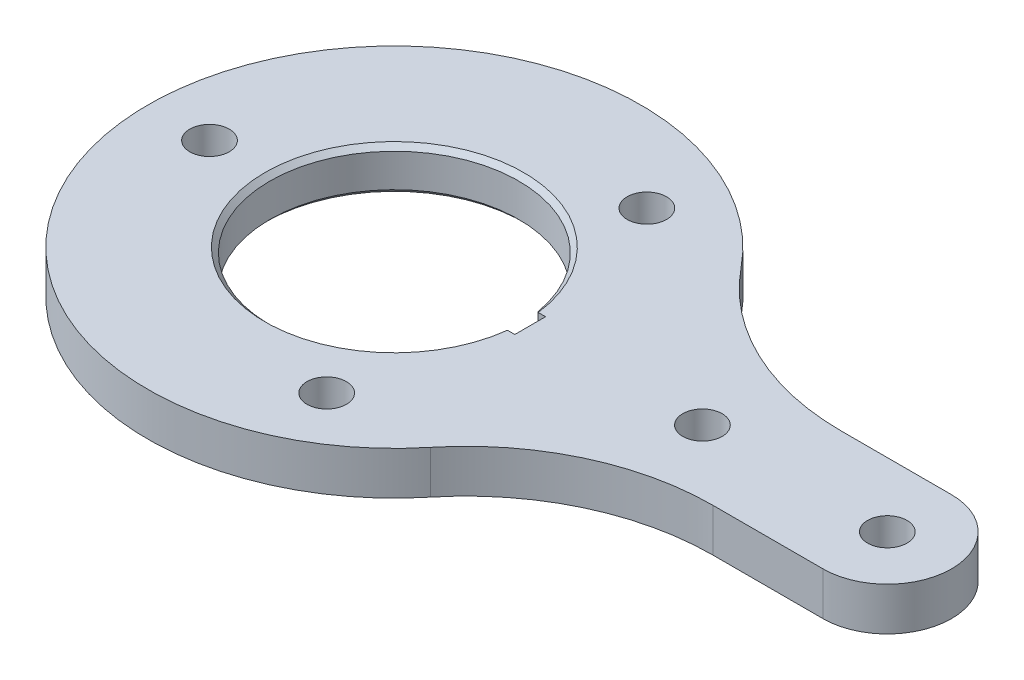
ISO-10303-21;
HEADER;
FILE_DESCRIPTION(('STEP AP214'),'2;1');
FILE_NAME('part.step','',(''),(''),'','','');
FILE_SCHEMA(('AUTOMOTIVE_DESIGN { 1 0 10303 214 1 1 1 1 }'));
ENDSEC;
DATA;
#1=APPLICATION_CONTEXT('core data for automotive mechanical design processes');
#2=APPLICATION_PROTOCOL_DEFINITION('international standard','automotive_design',2000,#1);
#3=PRODUCT_CONTEXT('',#1,'mechanical');
#4=PRODUCT('Part','Part','',(#3));
#5=PRODUCT_RELATED_PRODUCT_CATEGORY('part','',(#4));
#6=PRODUCT_DEFINITION_FORMATION('','',#4);
#7=PRODUCT_DEFINITION_CONTEXT('part definition',#1,'design');
#8=PRODUCT_DEFINITION('design','',#6,#7);
#9=PRODUCT_DEFINITION_SHAPE('','',#8);
#10=(LENGTH_UNIT() NAMED_UNIT(*) SI_UNIT(.MILLI.,.METRE.));
#11=(NAMED_UNIT(*) PLANE_ANGLE_UNIT() SI_UNIT($,.RADIAN.));
#12=(NAMED_UNIT(*) SI_UNIT($,.STERADIAN.) SOLID_ANGLE_UNIT());
#13=UNCERTAINTY_MEASURE_WITH_UNIT(LENGTH_MEASURE(1.E-05),#10,'distance_accuracy_value','');
#14=(GEOMETRIC_REPRESENTATION_CONTEXT(3) GLOBAL_UNCERTAINTY_ASSIGNED_CONTEXT((#13)) GLOBAL_UNIT_ASSIGNED_CONTEXT((#10,
#11,#12)) REPRESENTATION_CONTEXT('',''));
#15=CARTESIAN_POINT('',(0.,0.,0.));
#16=DIRECTION('',(0.,0.,1.));
#17=DIRECTION('',(1.,0.,0.));
#18=AXIS2_PLACEMENT_3D('',#15,#16,#17);
#19=CARTESIAN_POINT('',(-35.,1.75,25.));
#20=DIRECTION('',(0.,-1.,0.));
#21=DIRECTION('',(0.,0.,-1.));
#22=AXIS2_PLACEMENT_3D('',#19,#20,#21);
#23=PLANE('',#22);
#24=DIRECTION('',(1.,0.,0.));
#25=VECTOR('',#24,1.);
#26=CARTESIAN_POINT('',(-2.97764997617824,1.75,1.25));
#27=LINE('',#26,#25);
#28=CARTESIAN_POINT('',(-3.51711203719619,1.75,1.25));
#29=VERTEX_POINT('',#28);
#30=CARTESIAN_POINT('',(-2.97764997617824,1.75,1.25));
#31=VERTEX_POINT('',#30);
#32=EDGE_CURVE('E168',#29,#31,#27,.T.);
#33=ORIENTED_EDGE('',*,*,#32,.F.);
#34=DIRECTION('',(0.78918367740125,0.,-0.614157246414499));
#35=VECTOR('',#34,1.);
#36=CARTESIAN_POINT('',(-3.51711203719619,1.75,1.25));
#37=LINE('',#36,#35);
#38=CARTESIAN_POINT('',(-3.58072522275954,1.75,1.29950495049504));
#39=VERTEX_POINT('',#38);
#40=EDGE_CURVE('E304',#29,#39,#37,.F.);
#41=ORIENTED_EDGE('',*,*,#40,.T.);
#42=CARTESIAN_POINT('',(-14.,1.75,0.));
#43=DIRECTION('',(0.,-1.,0.));
#44=DIRECTION('',(0.,0.,-1.));
#45=AXIS2_PLACEMENT_3D('',#42,#43,#44);
#46=CIRCLE('',#45,10.5);
#47=CARTESIAN_POINT('',(-3.57467026900346,1.75,-1.25));
#48=VERTEX_POINT('',#47);
#49=EDGE_CURVE('E301',#39,#48,#46,.T.);
#50=ORIENTED_EDGE('',*,*,#49,.T.);
#51=DIRECTION('',(-1.,0.,0.));
#52=VECTOR('',#51,1.);
#53=CARTESIAN_POINT('',(-2.97764997617824,1.75,-1.25));
#54=LINE('',#53,#52);
#55=CARTESIAN_POINT('',(-2.97764997617824,1.75,-1.25));
#56=VERTEX_POINT('',#55);
#57=EDGE_CURVE('E162',#56,#48,#54,.T.);
#58=ORIENTED_EDGE('',*,*,#57,.F.);
#59=DIRECTION('',(0.,0.,-1.));
#60=VECTOR('',#59,1.);
#61=CARTESIAN_POINT('',(-2.97764997617824,1.75,1.25));
#62=LINE('',#61,#60);
#63=EDGE_CURVE('E185',#31,#56,#62,.T.);
#64=ORIENTED_EDGE('',*,*,#63,.F.);
#65=EDGE_LOOP('',(#33,#41,#50,#58,#64));
#66=FACE_BOUND('',#65,.T.);
#67=CARTESIAN_POINT('',(11.,1.75,0.));
#68=DIRECTION('',(0.,1.,0.));
#69=DIRECTION('',(-1.,0.,0.));
#70=AXIS2_PLACEMENT_3D('',#67,#68,#69);
#71=CIRCLE('',#70,1.6);
#72=CARTESIAN_POINT('',(9.4,1.75,0.));
#73=VERTEX_POINT('',#72);
#74=EDGE_CURVE('E272',#73,#73,#71,.T.);
#75=ORIENTED_EDGE('',*,*,#74,.F.);
#76=EDGE_LOOP('',(#75));
#77=FACE_BOUND('',#76,.T.);
#78=CARTESIAN_POINT('',(-6.50000000000012,1.75,12.9903810567666));
#79=DIRECTION('',(0.,1.,0.));
#80=DIRECTION('',(-1.,0.,0.));
#81=AXIS2_PLACEMENT_3D('',#78,#79,#80);
#82=CIRCLE('',#81,1.6);
#83=CARTESIAN_POINT('',(-8.10000000000012,1.75,12.9903810567666));
#84=VERTEX_POINT('',#83);
#85=EDGE_CURVE('E264',#84,#84,#82,.T.);
#86=ORIENTED_EDGE('',*,*,#85,.F.);
#87=EDGE_LOOP('',(#86));
#88=FACE_BOUND('',#87,.T.);
#89=CARTESIAN_POINT('',(-29.,1.75,0.));
#90=DIRECTION('',(0.,1.,0.));
#91=DIRECTION('',(1.,0.,0.));
#92=AXIS2_PLACEMENT_3D('',#89,#90,#91);
#93=CIRCLE('',#92,1.6);
#94=CARTESIAN_POINT('',(-27.4,1.75,0.));
#95=VERTEX_POINT('',#94);
#96=EDGE_CURVE('E263',#95,#95,#93,.T.);
#97=ORIENTED_EDGE('',*,*,#96,.F.);
#98=EDGE_LOOP('',(#97));
#99=FACE_BOUND('',#98,.T.);
#100=CARTESIAN_POINT('',(-6.49999999999994,1.75,-12.9903810567665));
#101=DIRECTION('',(0.,1.,0.));
#102=DIRECTION('',(-1.,0.,0.));
#103=AXIS2_PLACEMENT_3D('',#100,#101,#102);
#104=CIRCLE('',#103,1.6);
#105=CARTESIAN_POINT('',(-8.09999999999994,1.75,-12.9903810567665));
#106=VERTEX_POINT('',#105);
#107=EDGE_CURVE('E282',#106,#106,#104,.T.);
#108=ORIENTED_EDGE('',*,*,#107,.F.);
#109=EDGE_LOOP('',(#108));
#110=FACE_BOUND('',#109,.T.);
#111=CARTESIAN_POINT('',(26.,1.75,0.));
#112=DIRECTION('',(0.,1.,0.));
#113=DIRECTION('',(-1.,0.,0.));
#114=AXIS2_PLACEMENT_3D('',#111,#112,#113);
#115=CIRCLE('',#114,1.60000000000001);
#116=CARTESIAN_POINT('',(24.4,1.75,0.));
#117=VERTEX_POINT('',#116);
#118=EDGE_CURVE('E243',#117,#117,#115,.T.);
#119=ORIENTED_EDGE('',*,*,#118,.F.);
#120=EDGE_LOOP('',(#119));
#121=FACE_BOUND('',#120,.T.);
#122=CARTESIAN_POINT('',(17.0547121487669,1.75,-25.2206659498865));
#123=DIRECTION('',(0.,-1.,0.));
#124=DIRECTION('',(0.,0.,1.));
#125=AXIS2_PLACEMENT_3D('',#122,#123,#124);
#126=CIRCLE('',#125,20.005963775399);
#127=CARTESIAN_POINT('',(17.0547121487669,1.75,-5.21470217448756));
#128=VERTEX_POINT('',#127);
#129=CARTESIAN_POINT('',(1.52504137788749,1.75,-12.6084531253791));
#130=VERTEX_POINT('',#129);
#131=EDGE_CURVE('E191',#128,#130,#126,.T.);
#132=ORIENTED_EDGE('',*,*,#131,.T.);
#133=CARTESIAN_POINT('',(-14.,1.75,0.));
#134=DIRECTION('',(0.,1.,0.));
#135=DIRECTION('',(0.,0.,1.));
#136=AXIS2_PLACEMENT_3D('',#133,#134,#135);
#137=CIRCLE('',#136,20.);
#138=CARTESIAN_POINT('',(1.52504137788749,1.75,12.6084531253791));
#139=VERTEX_POINT('',#138);
#140=EDGE_CURVE('E221',#130,#139,#137,.T.);
#141=ORIENTED_EDGE('',*,*,#140,.T.);
#142=CARTESIAN_POINT('',(17.0547121487669,1.75,25.2206659498865));
#143=DIRECTION('',(0.,-1.,0.));
#144=DIRECTION('',(0.,0.,-1.));
#145=AXIS2_PLACEMENT_3D('',#142,#143,#144);
#146=CIRCLE('',#145,20.005963775399);
#147=CARTESIAN_POINT('',(17.0547121487669,1.75,5.21470217448756));
#148=VERTEX_POINT('',#147);
#149=EDGE_CURVE('E225',#139,#148,#146,.T.);
#150=ORIENTED_EDGE('',*,*,#149,.T.);
#151=DIRECTION('',(1.,0.,0.));
#152=VECTOR('',#151,1.);
#153=CARTESIAN_POINT('',(17.0547121487669,1.75,5.21470217448757));
#154=LINE('',#153,#152);
#155=CARTESIAN_POINT('',(26.,1.75,5.21470217448757));
#156=VERTEX_POINT('',#155);
#157=EDGE_CURVE('E229',#148,#156,#154,.T.);
#158=ORIENTED_EDGE('',*,*,#157,.T.);
#159=CARTESIAN_POINT('',(26.,1.75,0.));
#160=DIRECTION('',(0.,1.,0.));
#161=DIRECTION('',(0.,0.,1.));
#162=AXIS2_PLACEMENT_3D('',#159,#160,#161);
#163=CIRCLE('',#162,5.21470217448757);
#164=CARTESIAN_POINT('',(26.,1.75,-5.21470217448757));
#165=VERTEX_POINT('',#164);
#166=EDGE_CURVE('E233',#156,#165,#163,.T.);
#167=ORIENTED_EDGE('',*,*,#166,.T.);
#168=DIRECTION('',(-1.,0.,0.));
#169=VECTOR('',#168,1.);
#170=CARTESIAN_POINT('',(17.0547121487669,1.75,-5.21470217448756));
#171=LINE('',#170,#169);
#172=EDGE_CURVE('E197',#165,#128,#171,.T.);
#173=ORIENTED_EDGE('',*,*,#172,.T.);
#174=EDGE_LOOP('',(#132,#141,#150,#158,#167,#173));
#175=FACE_BOUND('',#174,.T.);
#176=ADVANCED_FACE('F42',(#66,#77,#88,#99,#110,#121,#175),#23,.F.);
#177=CARTESIAN_POINT('',(-35.,-1.75,25.));
#178=DIRECTION('',(0.,1.,0.));
#179=DIRECTION('',(0.,0.,1.));
#180=AXIS2_PLACEMENT_3D('',#177,#178,#179);
#181=PLANE('',#180);
#182=CARTESIAN_POINT('',(-14.,-1.75,0.));
#183=DIRECTION('',(0.,1.,0.));
#184=DIRECTION('',(0.,0.,1.));
#185=AXIS2_PLACEMENT_3D('',#182,#183,#184);
#186=CIRCLE('',#185,10.5);
#187=CARTESIAN_POINT('',(-3.57467026900349,-1.75,-1.25));
#188=VERTEX_POINT('',#187);
#189=CARTESIAN_POINT('',(-3.58072522275957,-1.75,1.29950495049507));
#190=VERTEX_POINT('',#189);
#191=EDGE_CURVE('E320',#188,#190,#186,.T.);
#192=ORIENTED_EDGE('',*,*,#191,.T.);
#193=DIRECTION('',(-0.78918367740125,0.,0.614157246414499));
#194=VECTOR('',#193,1.);
#195=CARTESIAN_POINT('',(-3.51711203719619,-1.75,1.25));
#196=LINE('',#195,#194);
#197=CARTESIAN_POINT('',(-3.51711203719619,-1.75,1.25));
#198=VERTEX_POINT('',#197);
#199=EDGE_CURVE('E157',#190,#198,#196,.F.);
#200=ORIENTED_EDGE('',*,*,#199,.T.);
#201=DIRECTION('',(1.,0.,0.));
#202=VECTOR('',#201,1.);
#203=CARTESIAN_POINT('',(-2.97764997617824,-1.75,1.25));
#204=LINE('',#203,#202);
#205=CARTESIAN_POINT('',(-2.97764997617824,-1.75,1.25));
#206=VERTEX_POINT('',#205);
#207=EDGE_CURVE('E149',#198,#206,#204,.T.);
#208=ORIENTED_EDGE('',*,*,#207,.T.);
#209=DIRECTION('',(0.,0.,-1.));
#210=VECTOR('',#209,1.);
#211=CARTESIAN_POINT('',(-2.97764997617824,-1.75,1.25));
#212=LINE('',#211,#210);
#213=CARTESIAN_POINT('',(-2.97764997617824,-1.75,-1.25));
#214=VERTEX_POINT('',#213);
#215=EDGE_CURVE('E155',#206,#214,#212,.T.);
#216=ORIENTED_EDGE('',*,*,#215,.T.);
#217=DIRECTION('',(-1.,0.,0.));
#218=VECTOR('',#217,1.);
#219=CARTESIAN_POINT('',(-2.97764997617824,-1.75,-1.25));
#220=LINE('',#219,#218);
#221=EDGE_CURVE('E174',#214,#188,#220,.T.);
#222=ORIENTED_EDGE('',*,*,#221,.T.);
#223=EDGE_LOOP('',(#192,#200,#208,#216,#222));
#224=FACE_BOUND('',#223,.T.);
#225=CARTESIAN_POINT('',(11.,-1.75,0.));
#226=DIRECTION('',(0.,1.,0.));
#227=DIRECTION('',(-1.,0.,0.));
#228=AXIS2_PLACEMENT_3D('',#225,#226,#227);
#229=CIRCLE('',#228,1.6);
#230=CARTESIAN_POINT('',(9.4,-1.75,0.));
#231=VERTEX_POINT('',#230);
#232=EDGE_CURVE('E268',#231,#231,#229,.T.);
#233=ORIENTED_EDGE('',*,*,#232,.T.);
#234=EDGE_LOOP('',(#233));
#235=FACE_BOUND('',#234,.T.);
#236=CARTESIAN_POINT('',(-6.50000000000012,-1.75,12.9903810567666));
#237=DIRECTION('',(0.,1.,0.));
#238=DIRECTION('',(-1.,0.,0.));
#239=AXIS2_PLACEMENT_3D('',#236,#237,#238);
#240=CIRCLE('',#239,1.6);
#241=CARTESIAN_POINT('',(-8.10000000000012,-1.75,12.9903810567666));
#242=VERTEX_POINT('',#241);
#243=EDGE_CURVE('E259',#242,#242,#240,.T.);
#244=ORIENTED_EDGE('',*,*,#243,.T.);
#245=EDGE_LOOP('',(#244));
#246=FACE_BOUND('',#245,.T.);
#247=CARTESIAN_POINT('',(-29.,-1.75,0.));
#248=DIRECTION('',(0.,1.,0.));
#249=DIRECTION('',(1.,0.,0.));
#250=AXIS2_PLACEMENT_3D('',#247,#248,#249);
#251=CIRCLE('',#250,1.6);
#252=CARTESIAN_POINT('',(-27.4,-1.75,0.));
#253=VERTEX_POINT('',#252);
#254=EDGE_CURVE('E286',#253,#253,#251,.T.);
#255=ORIENTED_EDGE('',*,*,#254,.T.);
#256=EDGE_LOOP('',(#255));
#257=FACE_BOUND('',#256,.T.);
#258=CARTESIAN_POINT('',(-6.49999999999994,-1.75,-12.9903810567665));
#259=DIRECTION('',(0.,1.,0.));
#260=DIRECTION('',(-1.,0.,0.));
#261=AXIS2_PLACEMENT_3D('',#258,#259,#260);
#262=CIRCLE('',#261,1.6);
#263=CARTESIAN_POINT('',(-8.09999999999994,-1.75,-12.9903810567665));
#264=VERTEX_POINT('',#263);
#265=EDGE_CURVE('E277',#264,#264,#262,.T.);
#266=ORIENTED_EDGE('',*,*,#265,.T.);
#267=EDGE_LOOP('',(#266));
#268=FACE_BOUND('',#267,.T.);
#269=CARTESIAN_POINT('',(26.,-1.75,0.));
#270=DIRECTION('',(0.,1.,0.));
#271=DIRECTION('',(-1.,0.,0.));
#272=AXIS2_PLACEMENT_3D('',#269,#270,#271);
#273=CIRCLE('',#272,1.60000000000001);
#274=CARTESIAN_POINT('',(24.4,-1.75,0.));
#275=VERTEX_POINT('',#274);
#276=EDGE_CURVE('E276',#275,#275,#273,.T.);
#277=ORIENTED_EDGE('',*,*,#276,.T.);
#278=EDGE_LOOP('',(#277));
#279=FACE_BOUND('',#278,.T.);
#280=CARTESIAN_POINT('',(17.0547121487669,-1.75,-25.2206659498865));
#281=DIRECTION('',(0.,-1.,0.));
#282=DIRECTION('',(0.,0.,1.));
#283=AXIS2_PLACEMENT_3D('',#280,#281,#282);
#284=CIRCLE('',#283,20.005963775399);
#285=CARTESIAN_POINT('',(17.0547121487669,-1.75,-5.21470217448756));
#286=VERTEX_POINT('',#285);
#287=CARTESIAN_POINT('',(1.52504137788749,-1.75,-12.6084531253791));
#288=VERTEX_POINT('',#287);
#289=EDGE_CURVE('E193',#286,#288,#284,.T.);
#290=ORIENTED_EDGE('',*,*,#289,.F.);
#291=DIRECTION('',(-1.,0.,0.));
#292=VECTOR('',#291,1.);
#293=CARTESIAN_POINT('',(17.0547121487669,-1.75,-5.21470217448756));
#294=LINE('',#293,#292);
#295=CARTESIAN_POINT('',(26.,-1.75,-5.21470217448757));
#296=VERTEX_POINT('',#295);
#297=EDGE_CURVE('E213',#296,#286,#294,.T.);
#298=ORIENTED_EDGE('',*,*,#297,.F.);
#299=CARTESIAN_POINT('',(26.,-1.75,0.));
#300=DIRECTION('',(0.,1.,0.));
#301=DIRECTION('',(0.,0.,1.));
#302=AXIS2_PLACEMENT_3D('',#299,#300,#301);
#303=CIRCLE('',#302,5.21470217448757);
#304=CARTESIAN_POINT('',(26.,-1.75,5.21470217448757));
#305=VERTEX_POINT('',#304);
#306=EDGE_CURVE('E209',#305,#296,#303,.T.);
#307=ORIENTED_EDGE('',*,*,#306,.F.);
#308=DIRECTION('',(1.,0.,0.));
#309=VECTOR('',#308,1.);
#310=CARTESIAN_POINT('',(17.0547121487669,-1.75,5.21470217448757));
#311=LINE('',#310,#309);
#312=CARTESIAN_POINT('',(17.0547121487669,-1.75,5.21470217448756));
#313=VERTEX_POINT('',#312);
#314=EDGE_CURVE('E205',#313,#305,#311,.T.);
#315=ORIENTED_EDGE('',*,*,#314,.F.);
#316=CARTESIAN_POINT('',(17.0547121487669,-1.75,25.2206659498865));
#317=DIRECTION('',(0.,-1.,0.));
#318=DIRECTION('',(0.,0.,-1.));
#319=AXIS2_PLACEMENT_3D('',#316,#317,#318);
#320=CIRCLE('',#319,20.005963775399);
#321=CARTESIAN_POINT('',(1.52504137788749,-1.75,12.6084531253791));
#322=VERTEX_POINT('',#321);
#323=EDGE_CURVE('E201',#322,#313,#320,.T.);
#324=ORIENTED_EDGE('',*,*,#323,.F.);
#325=CARTESIAN_POINT('',(-14.,-1.75,0.));
#326=DIRECTION('',(0.,1.,0.));
#327=DIRECTION('',(0.,0.,1.));
#328=AXIS2_PLACEMENT_3D('',#325,#326,#327);
#329=CIRCLE('',#328,20.);
#330=EDGE_CURVE('E196',#288,#322,#329,.T.);
#331=ORIENTED_EDGE('',*,*,#330,.F.);
#332=EDGE_LOOP('',(#290,#298,#307,#315,#324,#331));
#333=FACE_BOUND('',#332,.T.);
#334=ADVANCED_FACE('F151',(#224,#235,#246,#257,#268,#279,#333),#181,.F.);
#335=CARTESIAN_POINT('',(-14.,-1.75,0.));
#336=DIRECTION('',(0.,1.,0.));
#337=DIRECTION('',(-1.,0.,0.));
#338=AXIS2_PLACEMENT_3D('',#335,#336,#337);
#339=CYLINDRICAL_SURFACE('',#338,10.1);
#340=DIRECTION('',(0.,1.,0.));
#341=VECTOR('',#340,1.);
#342=CARTESIAN_POINT('',(-4.0363675024982,-1.75,1.65409414929323));
#343=LINE('',#342,#341);
#344=CARTESIAN_POINT('',(-4.0363675024982,1.34999999999999,1.65409414929323));
#345=VERTEX_POINT('',#344);
#346=CARTESIAN_POINT('',(-4.0363675024982,-1.35000000000001,1.65409414929323));
#347=VERTEX_POINT('',#346);
#348=EDGE_CURVE('E313',#345,#347,#343,.F.);
#349=ORIENTED_EDGE('',*,*,#348,.T.);
#350=CARTESIAN_POINT('',(-14.,-1.35000000000001,0.));
#351=DIRECTION('',(0.,1.,0.));
#352=DIRECTION('',(0.,0.,1.));
#353=AXIS2_PLACEMENT_3D('',#350,#351,#352);
#354=CIRCLE('',#353,10.1);
#355=CARTESIAN_POINT('',(-4.0475085242653,-1.35000000000001,-1.71985854808705));
#356=VERTEX_POINT('',#355);
#357=EDGE_CURVE('E317',#347,#356,#354,.F.);
#358=ORIENTED_EDGE('',*,*,#357,.T.);
#359=DIRECTION('',(0.,1.,0.));
#360=VECTOR('',#359,1.);
#361=CARTESIAN_POINT('',(-4.0475085242653,-1.75,-1.71985854808705));
#362=LINE('',#361,#360);
#363=CARTESIAN_POINT('',(-4.0475085242653,1.34999999999999,-1.71985854808705));
#364=VERTEX_POINT('',#363);
#365=EDGE_CURVE('E310',#356,#364,#362,.T.);
#366=ORIENTED_EDGE('',*,*,#365,.T.);
#367=CARTESIAN_POINT('',(-14.,1.34999999999999,0.));
#368=DIRECTION('',(0.,-1.,0.));
#369=DIRECTION('',(0.,0.,-1.));
#370=AXIS2_PLACEMENT_3D('',#367,#368,#369);
#371=CIRCLE('',#370,10.1);
#372=EDGE_CURVE('E307',#364,#345,#371,.F.);
#373=ORIENTED_EDGE('',*,*,#372,.T.);
#374=EDGE_LOOP('',(#349,#358,#366,#373));
#375=FACE_BOUND('',#374,.T.);
#376=ADVANCED_FACE('F393',(#375),#339,.F.);
#377=CARTESIAN_POINT('',(11.,-1.75,0.));
#378=DIRECTION('',(0.,1.,0.));
#379=DIRECTION('',(-1.,0.,0.));
#380=AXIS2_PLACEMENT_3D('',#377,#378,#379);
#381=CYLINDRICAL_SURFACE('',#380,1.6);
#382=ORIENTED_EDGE('',*,*,#232,.F.);
#383=EDGE_LOOP('',(#382));
#384=FACE_BOUND('',#383,.T.);
#385=ORIENTED_EDGE('',*,*,#74,.T.);
#386=EDGE_LOOP('',(#385));
#387=FACE_BOUND('',#386,.T.);
#388=ADVANCED_FACE('F443',(#384,#387),#381,.F.);
#389=CARTESIAN_POINT('',(-6.50000000000012,-1.75,12.9903810567666));
#390=DIRECTION('',(0.,1.,0.));
#391=DIRECTION('',(-1.,0.,0.));
#392=AXIS2_PLACEMENT_3D('',#389,#390,#391);
#393=CYLINDRICAL_SURFACE('',#392,1.6);
#394=ORIENTED_EDGE('',*,*,#243,.F.);
#395=EDGE_LOOP('',(#394));
#396=FACE_BOUND('',#395,.T.);
#397=ORIENTED_EDGE('',*,*,#85,.T.);
#398=EDGE_LOOP('',(#397));
#399=FACE_BOUND('',#398,.T.);
#400=ADVANCED_FACE('F454',(#396,#399),#393,.F.);
#401=CARTESIAN_POINT('',(-29.,-1.75,0.));
#402=DIRECTION('',(0.,1.,0.));
#403=DIRECTION('',(-1.,0.,0.));
#404=AXIS2_PLACEMENT_3D('',#401,#402,#403);
#405=CYLINDRICAL_SURFACE('',#404,1.6);
#406=ORIENTED_EDGE('',*,*,#254,.F.);
#407=EDGE_LOOP('',(#406));
#408=FACE_BOUND('',#407,.T.);
#409=ORIENTED_EDGE('',*,*,#96,.T.);
#410=EDGE_LOOP('',(#409));
#411=FACE_BOUND('',#410,.T.);
#412=ADVANCED_FACE('F451',(#408,#411),#405,.F.);
#413=CARTESIAN_POINT('',(-6.49999999999994,-1.75,-12.9903810567665));
#414=DIRECTION('',(0.,1.,0.));
#415=DIRECTION('',(-1.,0.,0.));
#416=AXIS2_PLACEMENT_3D('',#413,#414,#415);
#417=CYLINDRICAL_SURFACE('',#416,1.6);
#418=ORIENTED_EDGE('',*,*,#265,.F.);
#419=EDGE_LOOP('',(#418));
#420=FACE_BOUND('',#419,.T.);
#421=ORIENTED_EDGE('',*,*,#107,.T.);
#422=EDGE_LOOP('',(#421));
#423=FACE_BOUND('',#422,.T.);
#424=ADVANCED_FACE('F449',(#420,#423),#417,.F.);
#425=CARTESIAN_POINT('',(26.,-1.75,0.));
#426=DIRECTION('',(0.,1.,0.));
#427=DIRECTION('',(-1.,0.,0.));
#428=AXIS2_PLACEMENT_3D('',#425,#426,#427);
#429=CYLINDRICAL_SURFACE('',#428,1.60000000000001);
#430=ORIENTED_EDGE('',*,*,#276,.F.);
#431=EDGE_LOOP('',(#430));
#432=FACE_BOUND('',#431,.T.);
#433=ORIENTED_EDGE('',*,*,#118,.T.);
#434=EDGE_LOOP('',(#433));
#435=FACE_BOUND('',#434,.T.);
#436=ADVANCED_FACE('F446',(#432,#435),#429,.F.);
#437=CARTESIAN_POINT('',(17.0547121487669,-1.75,-25.2206659498865));
#438=DIRECTION('',(0.,1.,0.));
#439=DIRECTION('',(0.,0.,1.));
#440=AXIS2_PLACEMENT_3D('',#437,#438,#439);
#441=CYLINDRICAL_SURFACE('',#440,20.005963775399);
#442=ORIENTED_EDGE('',*,*,#131,.F.);
#443=DIRECTION('',(0.,1.,0.));
#444=VECTOR('',#443,1.);
#445=CARTESIAN_POINT('',(17.0547121487669,-1.75,-5.21470217448756));
#446=LINE('',#445,#444);
#447=EDGE_CURVE('E240',#286,#128,#446,.T.);
#448=ORIENTED_EDGE('',*,*,#447,.F.);
#449=ORIENTED_EDGE('',*,*,#289,.T.);
#450=DIRECTION('',(0.,1.,0.));
#451=VECTOR('',#450,1.);
#452=CARTESIAN_POINT('',(1.52504137788749,-1.75,-12.6084531253791));
#453=LINE('',#452,#451);
#454=EDGE_CURVE('E217',#288,#130,#453,.T.);
#455=ORIENTED_EDGE('',*,*,#454,.T.);
#456=EDGE_LOOP('',(#442,#448,#449,#455));
#457=FACE_BOUND('',#456,.T.);
#458=ADVANCED_FACE('F418',(#457),#441,.F.);
#459=CARTESIAN_POINT('',(17.0547121487669,-1.75,-5.21470217448756));
#460=DIRECTION('',(0.,0.,-1.));
#461=DIRECTION('',(-1.,0.,0.));
#462=AXIS2_PLACEMENT_3D('',#459,#460,#461);
#463=PLANE('',#462);
#464=ORIENTED_EDGE('',*,*,#172,.F.);
#465=DIRECTION('',(0.,1.,0.));
#466=VECTOR('',#465,1.);
#467=CARTESIAN_POINT('',(26.,-1.75,-5.21470217448757));
#468=LINE('',#467,#466);
#469=EDGE_CURVE('E244',#296,#165,#468,.T.);
#470=ORIENTED_EDGE('',*,*,#469,.F.);
#471=ORIENTED_EDGE('',*,*,#297,.T.);
#472=ORIENTED_EDGE('',*,*,#447,.T.);
#473=EDGE_LOOP('',(#464,#470,#471,#472));
#474=FACE_BOUND('',#473,.T.);
#475=ADVANCED_FACE('F436',(#474),#463,.T.);
#476=CARTESIAN_POINT('',(26.,-1.75,0.));
#477=DIRECTION('',(0.,1.,0.));
#478=DIRECTION('',(0.,0.,1.));
#479=AXIS2_PLACEMENT_3D('',#476,#477,#478);
#480=CYLINDRICAL_SURFACE('',#479,5.21470217448757);
#481=ORIENTED_EDGE('',*,*,#166,.F.);
#482=DIRECTION('',(0.,1.,0.));
#483=VECTOR('',#482,1.);
#484=CARTESIAN_POINT('',(26.,-1.75,5.21470217448757));
#485=LINE('',#484,#483);
#486=EDGE_CURVE('E247',#305,#156,#485,.T.);
#487=ORIENTED_EDGE('',*,*,#486,.F.);
#488=ORIENTED_EDGE('',*,*,#306,.T.);
#489=ORIENTED_EDGE('',*,*,#469,.T.);
#490=EDGE_LOOP('',(#481,#487,#488,#489));
#491=FACE_BOUND('',#490,.T.);
#492=ADVANCED_FACE('F433',(#491),#480,.T.);
#493=CARTESIAN_POINT('',(17.0547121487669,-1.75,5.21470217448757));
#494=DIRECTION('',(0.,0.,1.));
#495=DIRECTION('',(1.,0.,0.));
#496=AXIS2_PLACEMENT_3D('',#493,#494,#495);
#497=PLANE('',#496);
#498=ORIENTED_EDGE('',*,*,#157,.F.);
#499=DIRECTION('',(0.,1.,0.));
#500=VECTOR('',#499,1.);
#501=CARTESIAN_POINT('',(17.0547121487669,-1.75,5.21470217448756));
#502=LINE('',#501,#500);
#503=EDGE_CURVE('E250',#313,#148,#502,.T.);
#504=ORIENTED_EDGE('',*,*,#503,.F.);
#505=ORIENTED_EDGE('',*,*,#314,.T.);
#506=ORIENTED_EDGE('',*,*,#486,.T.);
#507=EDGE_LOOP('',(#498,#504,#505,#506));
#508=FACE_BOUND('',#507,.T.);
#509=ADVANCED_FACE('F430',(#508),#497,.T.);
#510=CARTESIAN_POINT('',(17.0547121487669,-1.75,25.2206659498865));
#511=DIRECTION('',(0.,1.,0.));
#512=DIRECTION('',(0.,0.,1.));
#513=AXIS2_PLACEMENT_3D('',#510,#511,#512);
#514=CYLINDRICAL_SURFACE('',#513,20.005963775399);
#515=ORIENTED_EDGE('',*,*,#149,.F.);
#516=DIRECTION('',(0.,1.,0.));
#517=VECTOR('',#516,1.);
#518=CARTESIAN_POINT('',(1.52504137788749,-1.75,12.6084531253791));
#519=LINE('',#518,#517);
#520=EDGE_CURVE('E253',#322,#139,#519,.T.);
#521=ORIENTED_EDGE('',*,*,#520,.F.);
#522=ORIENTED_EDGE('',*,*,#323,.T.);
#523=ORIENTED_EDGE('',*,*,#503,.T.);
#524=EDGE_LOOP('',(#515,#521,#522,#523));
#525=FACE_BOUND('',#524,.T.);
#526=ADVANCED_FACE('F425',(#525),#514,.F.);
#527=CARTESIAN_POINT('',(-14.,-1.75,0.));
#528=DIRECTION('',(0.,1.,0.));
#529=DIRECTION('',(0.,0.,1.));
#530=AXIS2_PLACEMENT_3D('',#527,#528,#529);
#531=CYLINDRICAL_SURFACE('',#530,20.);
#532=ORIENTED_EDGE('',*,*,#140,.F.);
#533=ORIENTED_EDGE('',*,*,#454,.F.);
#534=ORIENTED_EDGE('',*,*,#330,.T.);
#535=ORIENTED_EDGE('',*,*,#520,.T.);
#536=EDGE_LOOP('',(#532,#533,#534,#535));
#537=FACE_BOUND('',#536,.T.);
#538=ADVANCED_FACE('F342',(#537),#531,.T.);
#539=CARTESIAN_POINT('',(-2.97764997617824,-1.75,-1.25));
#540=DIRECTION('',(0.,0.,-1.));
#541=DIRECTION('',(-1.,0.,0.));
#542=AXIS2_PLACEMENT_3D('',#539,#540,#541);
#543=PLANE('',#542);
#544=DIRECTION('',(0.,-1.,0.));
#545=VECTOR('',#544,1.);
#546=CARTESIAN_POINT('',(-3.57764997617824,-1.75,-1.25));
#547=LINE('',#546,#545);
#548=CARTESIAN_POINT('',(-3.57764997617824,1.74704148886995,-1.25));
#549=VERTEX_POINT('',#548);
#550=CARTESIAN_POINT('',(-3.57764997617824,-1.74704148886998,-1.25));
#551=VERTEX_POINT('',#550);
#552=EDGE_CURVE('E58',#549,#551,#547,.T.);
#553=ORIENTED_EDGE('',*,*,#552,.T.);
#554=CARTESIAN_POINT('',(-3.57764997617824,-1.74704148886998,-1.25));
#555=CARTESIAN_POINT('',(-3.57715335781626,-1.74753457355521,-1.25));
#556=CARTESIAN_POINT('',(-3.57665673970403,-1.74802765849199,-1.25));
#557=CARTESIAN_POINT('',(-3.57566350397912,-1.74901382886867,-1.25));
#558=CARTESIAN_POINT('',(-3.57516688636642,-1.74950691430856,-1.25));
#559=CARTESIAN_POINT('',(-3.57467026900349,-1.75,-1.25));
#560=B_SPLINE_CURVE_WITH_KNOTS('',3,(#554,#555,#556,#557,#558,#559),.UNSPECIFIED.,.F.,.F.,(4,2,
4),(0.,0.00209949059022358,0.0041989811804471),.UNSPECIFIED.);
#561=EDGE_CURVE('E12',#551,#188,#560,.T.);
#562=ORIENTED_EDGE('',*,*,#561,.T.);
#563=ORIENTED_EDGE('',*,*,#221,.F.);
#564=DIRECTION('',(0.,1.,0.));
#565=VECTOR('',#564,1.);
#566=CARTESIAN_POINT('',(-2.97764997617824,-1.75,-1.25));
#567=LINE('',#566,#565);
#568=EDGE_CURVE('E173',#214,#56,#567,.T.);
#569=ORIENTED_EDGE('',*,*,#568,.T.);
#570=ORIENTED_EDGE('',*,*,#57,.T.);
#571=CARTESIAN_POINT('',(-3.57467026900346,1.75,-1.25));
#572=CARTESIAN_POINT('',(-3.5751668863664,1.74950691430855,-1.25));
#573=CARTESIAN_POINT('',(-3.5756635039791,1.74901382886865,-1.25));
#574=CARTESIAN_POINT('',(-3.57665673970402,1.74802765849197,-1.25));
#575=CARTESIAN_POINT('',(-3.57715335781625,1.74753457355518,-1.25));
#576=CARTESIAN_POINT('',(-3.57764997617824,1.74704148886995,-1.25));
#577=B_SPLINE_CURVE_WITH_KNOTS('',3,(#571,#572,#573,#574,#575,#576),.UNSPECIFIED.,.F.,.F.,(4,2,
4),(0.,0.0020994905902456,0.00419898118049126),.UNSPECIFIED.);
#578=EDGE_CURVE('E69',#48,#549,#577,.T.);
#579=ORIENTED_EDGE('',*,*,#578,.T.);
#580=EDGE_LOOP('',(#553,#562,#563,#569,#570,#579));
#581=FACE_BOUND('',#580,.T.);
#582=ADVANCED_FACE('F338',(#581),#543,.F.);
#583=CARTESIAN_POINT('',(-2.97764997617824,-1.75,1.25));
#584=DIRECTION('',(1.,0.,0.));
#585=DIRECTION('',(0.,0.,-1.));
#586=AXIS2_PLACEMENT_3D('',#583,#584,#585);
#587=PLANE('',#586);
#588=ORIENTED_EDGE('',*,*,#63,.T.);
#589=ORIENTED_EDGE('',*,*,#568,.F.);
#590=ORIENTED_EDGE('',*,*,#215,.F.);
#591=DIRECTION('',(0.,1.,0.));
#592=VECTOR('',#591,1.);
#593=CARTESIAN_POINT('',(-2.97764997617824,-1.75,1.25));
#594=LINE('',#593,#592);
#595=EDGE_CURVE('E165',#206,#31,#594,.T.);
#596=ORIENTED_EDGE('',*,*,#595,.T.);
#597=EDGE_LOOP('',(#588,#589,#590,#596));
#598=FACE_BOUND('',#597,.T.);
#599=ADVANCED_FACE('F176',(#598),#587,.F.);
#600=CARTESIAN_POINT('',(-2.97764997617824,-1.75,1.25));
#601=DIRECTION('',(0.,0.,1.));
#602=DIRECTION('',(1.,0.,0.));
#603=AXIS2_PLACEMENT_3D('',#600,#601,#602);
#604=PLANE('',#603);
#605=ORIENTED_EDGE('',*,*,#207,.F.);
#606=DIRECTION('',(0.,1.,0.));
#607=VECTOR('',#606,1.);
#608=CARTESIAN_POINT('',(-3.51711203719619,-1.75,1.25));
#609=LINE('',#608,#607);
#610=EDGE_CURVE('E281',#198,#29,#609,.T.);
#611=ORIENTED_EDGE('',*,*,#610,.T.);
#612=ORIENTED_EDGE('',*,*,#32,.T.);
#613=ORIENTED_EDGE('',*,*,#595,.F.);
#614=EDGE_LOOP('',(#605,#611,#612,#613));
#615=FACE_BOUND('',#614,.T.);
#616=ADVANCED_FACE('F166',(#615),#604,.F.);
#617=CARTESIAN_POINT('',(-4.0475085242653,-1.75,-1.71985854808705));
#618=DIRECTION('',(0.707106781186546,0.,-0.707106781186549));
#619=DIRECTION('',(0.,1.,0.));
#620=AXIS2_PLACEMENT_3D('',#617,#618,#619);
#621=PLANE('',#620);
#622=CARTESIAN_POINT('',(-4.0475085242653,1.34999999999999,-1.71985854808705));
#623=CARTESIAN_POINT('',(-4.00798768933081,1.38221411423321,-1.68033771315257));
#624=CARTESIAN_POINT('',(-3.96856162422804,1.41466038896116,-1.64091164804979));
#625=CARTESIAN_POINT('',(-3.88989594743289,1.47999455114797,-1.56224597125464));
#626=CARTESIAN_POINT('',(-3.85065632498061,1.51288241269254,-1.52300634880236));
#627=CARTESIAN_POINT('',(-3.77235596700378,1.57908069390315,-1.44470599082553));
#628=CARTESIAN_POINT('',(-3.73329523085403,1.61239111209087,-1.40564525467579));
#629=CARTESIAN_POINT('',(-3.65534494781244,1.67941743061873,-1.32769497163419));
#630=CARTESIAN_POINT('',(-3.61645541105684,1.71313335453818,-1.2888054348786));
#631=CARTESIAN_POINT('',(-3.57764997617824,1.74704148886994,-1.25));
#632=B_SPLINE_CURVE_WITH_KNOTS('',3,(#622,#623,#624,#625,#626,#627,#628,#629,#630,#631),
.UNSPECIFIED.,.F.,.F.,(4,2,2,2,4),(0.,0.193529219862288,0.387047131778045,0.580564366854841,
0.774092909483922),.UNSPECIFIED.);
#633=EDGE_CURVE('E374',#364,#549,#632,.T.);
#634=ORIENTED_EDGE('',*,*,#633,.F.);
#635=ORIENTED_EDGE('',*,*,#365,.F.);
#636=CARTESIAN_POINT('',(-3.57764997617824,-1.74704148886998,-1.25));
#637=CARTESIAN_POINT('',(-3.61645541105684,-1.71313335453821,-1.2888054348786));
#638=CARTESIAN_POINT('',(-3.65534494781244,-1.67941743061876,-1.32769497163419));
#639=CARTESIAN_POINT('',(-3.73329523085403,-1.6123911120909,-1.40564525467579));
#640=CARTESIAN_POINT('',(-3.77235596700378,-1.57908069390317,-1.44470599082553));
#641=CARTESIAN_POINT('',(-3.85065632498061,-1.51288241269256,-1.52300634880236));
#642=CARTESIAN_POINT('',(-3.88989594743289,-1.47999455114799,-1.56224597125464));
#643=CARTESIAN_POINT('',(-3.96856162422804,-1.41466038896118,-1.64091164804979));
#644=CARTESIAN_POINT('',(-4.00798768933081,-1.38221411423322,-1.68033771315256));
#645=CARTESIAN_POINT('',(-4.0475085242653,-1.35,-1.71985854808705));
#646=B_SPLINE_CURVE_WITH_KNOTS('',3,(#636,#637,#638,#639,#640,#641,#642,#643,#644,#645),
.UNSPECIFIED.,.F.,.F.,(4,2,2,2,4),(0.,0.193528542629083,0.387045777705881,0.58056368962164,
0.774092909483929),.UNSPECIFIED.);
#647=EDGE_CURVE('E48',#551,#356,#646,.T.);
#648=ORIENTED_EDGE('',*,*,#647,.F.);
#649=ORIENTED_EDGE('',*,*,#552,.F.);
#650=EDGE_LOOP('',(#634,#635,#648,#649));
#651=FACE_BOUND('',#650,.T.);
#652=ADVANCED_FACE('F45',(#651),#621,.F.);
#653=CARTESIAN_POINT('',(-14.,-1.75,0.));
#654=DIRECTION('',(0.,-1.,0.));
#655=DIRECTION('',(0.,0.,-1.));
#656=AXIS2_PLACEMENT_3D('',#653,#654,#655);
#657=CONICAL_SURFACE('',#656,10.5,0.785398163397446);
#658=ORIENTED_EDGE('',*,*,#647,.T.);
#659=ORIENTED_EDGE('',*,*,#357,.F.);
#660=CARTESIAN_POINT('',(-4.0363675024982,-1.35000000000001,1.65409414929323));
#661=CARTESIAN_POINT('',(-3.95990896215769,-1.41571906092994,1.59459270755659));
#662=CARTESIAN_POINT('',(-3.88370948425186,-1.48191194064729,1.53529287296932));
#663=CARTESIAN_POINT('',(-3.73182872482693,-1.61524527487306,1.41709647374966));
#664=CARTESIAN_POINT('',(-3.65614744281988,-1.68238572848904,1.35819990873754));
#665=CARTESIAN_POINT('',(-3.58072522275957,-1.75,1.29950495049507));
#666=B_SPLINE_CURVE_WITH_KNOTS('',3,(#660,#661,#662,#663,#664,#665),.UNSPECIFIED.,.F.,.F.,(4,2,
4),(0.,0.351196459640842,0.702392588540286),.UNSPECIFIED.);
#667=EDGE_CURVE('E368',#190,#347,#666,.F.);
#668=ORIENTED_EDGE('',*,*,#667,.F.);
#669=ORIENTED_EDGE('',*,*,#191,.F.);
#670=ORIENTED_EDGE('',*,*,#561,.F.);
#671=EDGE_LOOP('',(#658,#659,#668,#669,#670));
#672=FACE_BOUND('',#671,.T.);
#673=ADVANCED_FACE('F357',(#672),#657,.F.);
#674=CARTESIAN_POINT('',(-14.,1.34999999999999,0.));
#675=DIRECTION('',(0.,1.,0.));
#676=DIRECTION('',(0.,0.,1.));
#677=AXIS2_PLACEMENT_3D('',#674,#675,#676);
#678=CONICAL_SURFACE('',#677,10.1,0.785398163397463);
#679=ORIENTED_EDGE('',*,*,#578,.F.);
#680=ORIENTED_EDGE('',*,*,#49,.F.);
#681=CARTESIAN_POINT('',(-3.58072522275954,1.75,1.29950495049504));
#682=CARTESIAN_POINT('',(-3.65614744281985,1.68238572848904,1.35819990873751));
#683=CARTESIAN_POINT('',(-3.7318287248269,1.61524527487305,1.41709647374964));
#684=CARTESIAN_POINT('',(-3.88370948425184,1.48191194064727,1.53529287296931));
#685=CARTESIAN_POINT('',(-3.95990896215768,1.41571906092992,1.59459270755658));
#686=CARTESIAN_POINT('',(-4.0363675024982,1.34999999999999,1.65409414929323));
#687=B_SPLINE_CURVE_WITH_KNOTS('',3,(#681,#682,#683,#684,#685,#686),.UNSPECIFIED.,.F.,.F.,(4,2,
4),(0.,0.351196128899466,0.702392588540331),.UNSPECIFIED.);
#688=EDGE_CURVE('E350',#345,#39,#687,.F.);
#689=ORIENTED_EDGE('',*,*,#688,.F.);
#690=ORIENTED_EDGE('',*,*,#372,.F.);
#691=ORIENTED_EDGE('',*,*,#633,.T.);
#692=EDGE_LOOP('',(#679,#680,#689,#690,#691));
#693=FACE_BOUND('',#692,.T.);
#694=ADVANCED_FACE('F334',(#693),#678,.F.);
#695=CARTESIAN_POINT('',(-3.51711203719619,-1.75,1.25));
#696=DIRECTION('',(0.614157246414499,0.,0.78918367740125));
#697=DIRECTION('',(0.,1.,0.));
#698=AXIS2_PLACEMENT_3D('',#695,#696,#697);
#699=PLANE('',#698);
#700=ORIENTED_EDGE('',*,*,#667,.T.);
#701=ORIENTED_EDGE('',*,*,#348,.F.);
#702=ORIENTED_EDGE('',*,*,#688,.T.);
#703=ORIENTED_EDGE('',*,*,#40,.F.);
#704=ORIENTED_EDGE('',*,*,#610,.F.);
#705=ORIENTED_EDGE('',*,*,#199,.F.);
#706=EDGE_LOOP('',(#700,#701,#702,#703,#704,#705));
#707=FACE_BOUND('',#706,.T.);
#708=ADVANCED_FACE('F364',(#707),#699,.F.);
#709=CLOSED_SHELL('',(#176,#334,#376,#388,#400,#412,#424,#436,#458,#475,#492,#509,#526,#538,
#582,#599,#616,#652,#673,#694,#708));
#710=MANIFOLD_SOLID_BREP('B2',#709);
#711=ADVANCED_BREP_SHAPE_REPRESENTATION('',(#18,#710),#14);
#712=SHAPE_DEFINITION_REPRESENTATION(#9,#711);
ENDSEC;
END-ISO-10303-21;
